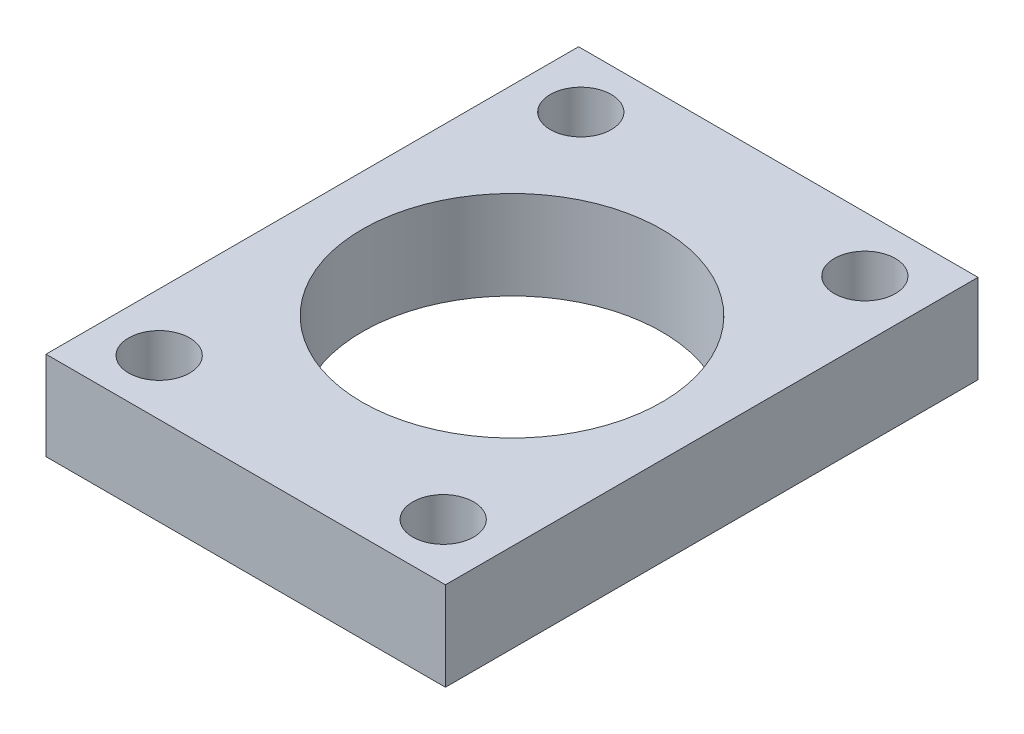
ISO-10303-21;
HEADER;
FILE_DESCRIPTION(('STEP AP214'),'2;1');
FILE_NAME('part.step','',(''),(''),'','','');
FILE_SCHEMA(('AUTOMOTIVE_DESIGN { 1 0 10303 214 1 1 1 1 }'));
ENDSEC;
DATA;
#1=APPLICATION_CONTEXT('core data for automotive mechanical design processes');
#2=APPLICATION_PROTOCOL_DEFINITION('international standard','automotive_design',2000,#1);
#3=PRODUCT_CONTEXT('',#1,'mechanical');
#4=PRODUCT('Part','Part','',(#3));
#5=PRODUCT_RELATED_PRODUCT_CATEGORY('part','',(#4));
#6=PRODUCT_DEFINITION_FORMATION('','',#4);
#7=PRODUCT_DEFINITION_CONTEXT('part definition',#1,'design');
#8=PRODUCT_DEFINITION('design','',#6,#7);
#9=PRODUCT_DEFINITION_SHAPE('','',#8);
#10=(LENGTH_UNIT() NAMED_UNIT(*) SI_UNIT(.MILLI.,.METRE.));
#11=(NAMED_UNIT(*) PLANE_ANGLE_UNIT() SI_UNIT($,.RADIAN.));
#12=(NAMED_UNIT(*) SI_UNIT($,.STERADIAN.) SOLID_ANGLE_UNIT());
#13=UNCERTAINTY_MEASURE_WITH_UNIT(LENGTH_MEASURE(1.E-05),#10,'distance_accuracy_value','');
#14=(GEOMETRIC_REPRESENTATION_CONTEXT(3) GLOBAL_UNCERTAINTY_ASSIGNED_CONTEXT((#13)) GLOBAL_UNIT_ASSIGNED_CONTEXT((#10,
#11,#12)) REPRESENTATION_CONTEXT('',''));
#15=CARTESIAN_POINT('',(0.,0.,0.));
#16=DIRECTION('',(0.,0.,1.));
#17=DIRECTION('',(1.,0.,0.));
#18=AXIS2_PLACEMENT_3D('',#15,#16,#17);
#19=CARTESIAN_POINT('',(-28.575,12.7,-38.1));
#20=DIRECTION('',(1.,0.,0.));
#21=DIRECTION('',(0.,0.,-1.));
#22=AXIS2_PLACEMENT_3D('',#19,#20,#21);
#23=PLANE('',#22);
#24=DIRECTION('',(0.,0.,1.));
#25=VECTOR('',#24,1.);
#26=CARTESIAN_POINT('',(-28.575,0.,-38.1));
#27=LINE('',#26,#25);
#28=CARTESIAN_POINT('',(-28.575,0.,-38.1));
#29=VERTEX_POINT('',#28);
#30=CARTESIAN_POINT('',(-28.575,0.,38.1));
#31=VERTEX_POINT('',#30);
#32=EDGE_CURVE('E75',#29,#31,#27,.T.);
#33=ORIENTED_EDGE('',*,*,#32,.T.);
#34=DIRECTION('',(0.,-1.,0.));
#35=VECTOR('',#34,1.);
#36=CARTESIAN_POINT('',(-28.575,12.7,38.1));
#37=LINE('',#36,#35);
#38=CARTESIAN_POINT('',(-28.575,12.7,38.1));
#39=VERTEX_POINT('',#38);
#40=EDGE_CURVE('E11',#39,#31,#37,.T.);
#41=ORIENTED_EDGE('',*,*,#40,.F.);
#42=DIRECTION('',(0.,0.,1.));
#43=VECTOR('',#42,1.);
#44=CARTESIAN_POINT('',(-28.575,12.7,-38.1));
#45=LINE('',#44,#43);
#46=CARTESIAN_POINT('',(-28.575,12.7,-38.1));
#47=VERTEX_POINT('',#46);
#48=EDGE_CURVE('E98',#47,#39,#45,.T.);
#49=ORIENTED_EDGE('',*,*,#48,.F.);
#50=DIRECTION('',(0.,-1.,0.));
#51=VECTOR('',#50,1.);
#52=CARTESIAN_POINT('',(-28.575,12.7,-38.1));
#53=LINE('',#52,#51);
#54=EDGE_CURVE('E87',#47,#29,#53,.T.);
#55=ORIENTED_EDGE('',*,*,#54,.T.);
#56=EDGE_LOOP('',(#33,#41,#49,#55));
#57=FACE_BOUND('',#56,.T.);
#58=ADVANCED_FACE('F31',(#57),#23,.F.);
#59=CARTESIAN_POINT('',(-28.575,12.7,38.1));
#60=DIRECTION('',(0.,0.,-1.));
#61=DIRECTION('',(-1.,0.,0.));
#62=AXIS2_PLACEMENT_3D('',#59,#60,#61);
#63=PLANE('',#62);
#64=DIRECTION('',(1.,0.,0.));
#65=VECTOR('',#64,1.);
#66=CARTESIAN_POINT('',(-28.575,0.,38.1));
#67=LINE('',#66,#65);
#68=CARTESIAN_POINT('',(28.575,0.,38.1));
#69=VERTEX_POINT('',#68);
#70=EDGE_CURVE('E71',#31,#69,#67,.T.);
#71=ORIENTED_EDGE('',*,*,#70,.T.);
#72=DIRECTION('',(0.,-1.,0.));
#73=VECTOR('',#72,1.);
#74=CARTESIAN_POINT('',(28.575,12.7,38.1));
#75=LINE('',#74,#73);
#76=CARTESIAN_POINT('',(28.575,12.7,38.1));
#77=VERTEX_POINT('',#76);
#78=EDGE_CURVE('E38',#77,#69,#75,.T.);
#79=ORIENTED_EDGE('',*,*,#78,.F.);
#80=DIRECTION('',(1.,0.,0.));
#81=VECTOR('',#80,1.);
#82=CARTESIAN_POINT('',(-28.575,12.7,38.1));
#83=LINE('',#82,#81);
#84=EDGE_CURVE('E83',#39,#77,#83,.T.);
#85=ORIENTED_EDGE('',*,*,#84,.F.);
#86=ORIENTED_EDGE('',*,*,#40,.T.);
#87=EDGE_LOOP('',(#71,#79,#85,#86));
#88=FACE_BOUND('',#87,.T.);
#89=ADVANCED_FACE('F82',(#88),#63,.F.);
#90=CARTESIAN_POINT('',(28.575,12.7,-38.1));
#91=DIRECTION('',(-1.,0.,0.));
#92=DIRECTION('',(0.,0.,1.));
#93=AXIS2_PLACEMENT_3D('',#90,#91,#92);
#94=PLANE('',#93);
#95=DIRECTION('',(0.,0.,-1.));
#96=VECTOR('',#95,1.);
#97=CARTESIAN_POINT('',(28.575,0.,-38.1));
#98=LINE('',#97,#96);
#99=CARTESIAN_POINT('',(28.575,0.,-38.1));
#100=VERTEX_POINT('',#99);
#101=EDGE_CURVE('E76',#69,#100,#98,.T.);
#102=ORIENTED_EDGE('',*,*,#101,.T.);
#103=DIRECTION('',(0.,-1.,0.));
#104=VECTOR('',#103,1.);
#105=CARTESIAN_POINT('',(28.575,12.7,-38.1));
#106=LINE('',#105,#104);
#107=CARTESIAN_POINT('',(28.575,12.7,-38.1));
#108=VERTEX_POINT('',#107);
#109=EDGE_CURVE('E104',#108,#100,#106,.T.);
#110=ORIENTED_EDGE('',*,*,#109,.F.);
#111=DIRECTION('',(0.,0.,-1.));
#112=VECTOR('',#111,1.);
#113=CARTESIAN_POINT('',(28.575,12.7,-38.1));
#114=LINE('',#113,#112);
#115=EDGE_CURVE('E50',#77,#108,#114,.T.);
#116=ORIENTED_EDGE('',*,*,#115,.F.);
#117=ORIENTED_EDGE('',*,*,#78,.T.);
#118=EDGE_LOOP('',(#102,#110,#116,#117));
#119=FACE_BOUND('',#118,.T.);
#120=ADVANCED_FACE('F107',(#119),#94,.F.);
#121=CARTESIAN_POINT('',(-28.575,12.7,-38.1));
#122=DIRECTION('',(0.,0.,1.));
#123=DIRECTION('',(1.,0.,0.));
#124=AXIS2_PLACEMENT_3D('',#121,#122,#123);
#125=PLANE('',#124);
#126=DIRECTION('',(-1.,0.,0.));
#127=VECTOR('',#126,1.);
#128=CARTESIAN_POINT('',(-28.575,0.,-38.1));
#129=LINE('',#128,#127);
#130=EDGE_CURVE('E96',#100,#29,#129,.T.);
#131=ORIENTED_EDGE('',*,*,#130,.T.);
#132=ORIENTED_EDGE('',*,*,#54,.F.);
#133=DIRECTION('',(-1.,0.,0.));
#134=VECTOR('',#133,1.);
#135=CARTESIAN_POINT('',(-28.575,12.7,-38.1));
#136=LINE('',#135,#134);
#137=EDGE_CURVE('E45',#108,#47,#136,.T.);
#138=ORIENTED_EDGE('',*,*,#137,.F.);
#139=ORIENTED_EDGE('',*,*,#109,.T.);
#140=EDGE_LOOP('',(#131,#132,#138,#139));
#141=FACE_BOUND('',#140,.T.);
#142=ADVANCED_FACE('F109',(#141),#125,.F.);
#143=CARTESIAN_POINT('',(-28.575,12.7,-38.1));
#144=DIRECTION('',(0.,1.,0.));
#145=DIRECTION('',(0.,0.,1.));
#146=AXIS2_PLACEMENT_3D('',#143,#144,#145);
#147=PLANE('',#146);
#148=CARTESIAN_POINT('',(-20.32,12.7,-30.1625));
#149=DIRECTION('',(0.,1.,0.));
#150=DIRECTION('',(0.,0.,1.));
#151=AXIS2_PLACEMENT_3D('',#148,#149,#150);
#152=CIRCLE('',#151,4.36498999999999);
#153=CARTESIAN_POINT('',(-20.32,12.7,-25.79751));
#154=VERTEX_POINT('',#153);
#155=EDGE_CURVE('E206',#154,#154,#152,.T.);
#156=ORIENTED_EDGE('',*,*,#155,.F.);
#157=EDGE_LOOP('',(#156));
#158=FACE_BOUND('',#157,.T.);
#159=CARTESIAN_POINT('',(20.32,12.7,-30.1625));
#160=DIRECTION('',(0.,1.,0.));
#161=DIRECTION('',(0.,0.,1.));
#162=AXIS2_PLACEMENT_3D('',#159,#160,#161);
#163=CIRCLE('',#162,4.36498999999999);
#164=CARTESIAN_POINT('',(20.32,12.7,-25.79751));
#165=VERTEX_POINT('',#164);
#166=EDGE_CURVE('E208',#165,#165,#163,.T.);
#167=ORIENTED_EDGE('',*,*,#166,.F.);
#168=EDGE_LOOP('',(#167));
#169=FACE_BOUND('',#168,.T.);
#170=CARTESIAN_POINT('',(20.32,12.7,30.1625));
#171=DIRECTION('',(0.,1.,0.));
#172=DIRECTION('',(0.,0.,1.));
#173=AXIS2_PLACEMENT_3D('',#170,#171,#172);
#174=CIRCLE('',#173,4.36498999999999);
#175=CARTESIAN_POINT('',(20.32,12.7,34.52749));
#176=VERTEX_POINT('',#175);
#177=EDGE_CURVE('E216',#176,#176,#174,.T.);
#178=ORIENTED_EDGE('',*,*,#177,.F.);
#179=EDGE_LOOP('',(#178));
#180=FACE_BOUND('',#179,.T.);
#181=CARTESIAN_POINT('',(-20.32,12.7,30.1625));
#182=DIRECTION('',(0.,1.,0.));
#183=DIRECTION('',(0.,0.,1.));
#184=AXIS2_PLACEMENT_3D('',#181,#182,#183);
#185=CIRCLE('',#184,4.36498999999999);
#186=CARTESIAN_POINT('',(-20.32,12.7,34.52749));
#187=VERTEX_POINT('',#186);
#188=EDGE_CURVE('E222',#187,#187,#185,.T.);
#189=ORIENTED_EDGE('',*,*,#188,.F.);
#190=EDGE_LOOP('',(#189));
#191=FACE_BOUND('',#190,.T.);
#192=CARTESIAN_POINT('',(0.,12.7,0.));
#193=DIRECTION('',(0.,1.,0.));
#194=DIRECTION('',(0.,0.,1.));
#195=AXIS2_PLACEMENT_3D('',#192,#193,#194);
#196=CIRCLE('',#195,21.43125);
#197=CARTESIAN_POINT('',(0.,12.7,21.43125));
#198=VERTEX_POINT('',#197);
#199=EDGE_CURVE('E91',#198,#198,#196,.T.);
#200=ORIENTED_EDGE('',*,*,#199,.F.);
#201=EDGE_LOOP('',(#200));
#202=FACE_BOUND('',#201,.T.);
#203=ORIENTED_EDGE('',*,*,#48,.T.);
#204=ORIENTED_EDGE('',*,*,#84,.T.);
#205=ORIENTED_EDGE('',*,*,#115,.T.);
#206=ORIENTED_EDGE('',*,*,#137,.T.);
#207=EDGE_LOOP('',(#203,#204,#205,#206));
#208=FACE_BOUND('',#207,.T.);
#209=ADVANCED_FACE('F110',(#158,#169,#180,#191,#202,#208),#147,.T.);
#210=CARTESIAN_POINT('',(-28.575,0.,-38.1));
#211=DIRECTION('',(0.,1.,0.));
#212=DIRECTION('',(0.,0.,1.));
#213=AXIS2_PLACEMENT_3D('',#210,#211,#212);
#214=PLANE('',#213);
#215=CARTESIAN_POINT('',(-20.32,0.,-30.1625));
#216=DIRECTION('',(0.,1.,0.));
#217=DIRECTION('',(0.,0.,1.));
#218=AXIS2_PLACEMENT_3D('',#215,#216,#217);
#219=CIRCLE('',#218,4.36499);
#220=CARTESIAN_POINT('',(-20.32,0.,-25.79751));
#221=VERTEX_POINT('',#220);
#222=EDGE_CURVE('E204',#221,#221,#219,.T.);
#223=ORIENTED_EDGE('',*,*,#222,.T.);
#224=EDGE_LOOP('',(#223));
#225=FACE_BOUND('',#224,.T.);
#226=CARTESIAN_POINT('',(20.32,0.,-30.1625));
#227=DIRECTION('',(0.,1.,0.));
#228=DIRECTION('',(0.,0.,1.));
#229=AXIS2_PLACEMENT_3D('',#226,#227,#228);
#230=CIRCLE('',#229,4.36499);
#231=CARTESIAN_POINT('',(20.32,0.,-25.79751));
#232=VERTEX_POINT('',#231);
#233=EDGE_CURVE('E213',#232,#232,#230,.T.);
#234=ORIENTED_EDGE('',*,*,#233,.T.);
#235=EDGE_LOOP('',(#234));
#236=FACE_BOUND('',#235,.T.);
#237=CARTESIAN_POINT('',(20.32,0.,30.1625));
#238=DIRECTION('',(0.,1.,0.));
#239=DIRECTION('',(0.,0.,1.));
#240=AXIS2_PLACEMENT_3D('',#237,#238,#239);
#241=CIRCLE('',#240,4.36499);
#242=CARTESIAN_POINT('',(20.32,0.,34.52749));
#243=VERTEX_POINT('',#242);
#244=EDGE_CURVE('E219',#243,#243,#241,.T.);
#245=ORIENTED_EDGE('',*,*,#244,.T.);
#246=EDGE_LOOP('',(#245));
#247=FACE_BOUND('',#246,.T.);
#248=CARTESIAN_POINT('',(-20.32,0.,30.1625));
#249=DIRECTION('',(0.,1.,0.));
#250=DIRECTION('',(0.,0.,1.));
#251=AXIS2_PLACEMENT_3D('',#248,#249,#250);
#252=CIRCLE('',#251,4.36499);
#253=CARTESIAN_POINT('',(-20.32,0.,34.52749));
#254=VERTEX_POINT('',#253);
#255=EDGE_CURVE('E225',#254,#254,#252,.T.);
#256=ORIENTED_EDGE('',*,*,#255,.T.);
#257=EDGE_LOOP('',(#256));
#258=FACE_BOUND('',#257,.T.);
#259=CARTESIAN_POINT('',(0.,0.,0.));
#260=DIRECTION('',(0.,1.,0.));
#261=DIRECTION('',(0.,0.,1.));
#262=AXIS2_PLACEMENT_3D('',#259,#260,#261);
#263=CIRCLE('',#262,21.43125);
#264=CARTESIAN_POINT('',(0.,0.,21.43125));
#265=VERTEX_POINT('',#264);
#266=EDGE_CURVE('E88',#265,#265,#263,.T.);
#267=ORIENTED_EDGE('',*,*,#266,.T.);
#268=EDGE_LOOP('',(#267));
#269=FACE_BOUND('',#268,.T.);
#270=ORIENTED_EDGE('',*,*,#32,.F.);
#271=ORIENTED_EDGE('',*,*,#130,.F.);
#272=ORIENTED_EDGE('',*,*,#101,.F.);
#273=ORIENTED_EDGE('',*,*,#70,.F.);
#274=EDGE_LOOP('',(#270,#271,#272,#273));
#275=FACE_BOUND('',#274,.T.);
#276=ADVANCED_FACE('F72',(#225,#236,#247,#258,#269,#275),#214,.F.);
#277=CARTESIAN_POINT('',(0.,0.,0.));
#278=DIRECTION('',(0.,1.,0.));
#279=DIRECTION('',(0.,0.,1.));
#280=AXIS2_PLACEMENT_3D('',#277,#278,#279);
#281=CYLINDRICAL_SURFACE('',#280,21.43125);
#282=ORIENTED_EDGE('',*,*,#266,.F.);
#283=EDGE_LOOP('',(#282));
#284=FACE_BOUND('',#283,.T.);
#285=ORIENTED_EDGE('',*,*,#199,.T.);
#286=EDGE_LOOP('',(#285));
#287=FACE_BOUND('',#286,.T.);
#288=ADVANCED_FACE('F118',(#284,#287),#281,.F.);
#289=CARTESIAN_POINT('',(-20.32,12.7,30.1625));
#290=DIRECTION('',(0.,1.,0.));
#291=DIRECTION('',(0.,0.,1.));
#292=AXIS2_PLACEMENT_3D('',#289,#290,#291);
#293=CYLINDRICAL_SURFACE('',#292,4.36498999999999);
#294=ORIENTED_EDGE('',*,*,#255,.F.);
#295=EDGE_LOOP('',(#294));
#296=FACE_BOUND('',#295,.T.);
#297=ORIENTED_EDGE('',*,*,#188,.T.);
#298=EDGE_LOOP('',(#297));
#299=FACE_BOUND('',#298,.T.);
#300=ADVANCED_FACE('F147',(#296,#299),#293,.F.);
#301=CARTESIAN_POINT('',(20.32,12.7,30.1625));
#302=DIRECTION('',(0.,1.,0.));
#303=DIRECTION('',(0.,0.,1.));
#304=AXIS2_PLACEMENT_3D('',#301,#302,#303);
#305=CYLINDRICAL_SURFACE('',#304,4.36498999999999);
#306=ORIENTED_EDGE('',*,*,#244,.F.);
#307=EDGE_LOOP('',(#306));
#308=FACE_BOUND('',#307,.T.);
#309=ORIENTED_EDGE('',*,*,#177,.T.);
#310=EDGE_LOOP('',(#309));
#311=FACE_BOUND('',#310,.T.);
#312=ADVANCED_FACE('F167',(#308,#311),#305,.F.);
#313=CARTESIAN_POINT('',(20.32,12.7,-30.1625));
#314=DIRECTION('',(0.,1.,0.));
#315=DIRECTION('',(0.,0.,1.));
#316=AXIS2_PLACEMENT_3D('',#313,#314,#315);
#317=CYLINDRICAL_SURFACE('',#316,4.36498999999999);
#318=ORIENTED_EDGE('',*,*,#233,.F.);
#319=EDGE_LOOP('',(#318));
#320=FACE_BOUND('',#319,.T.);
#321=ORIENTED_EDGE('',*,*,#166,.T.);
#322=EDGE_LOOP('',(#321));
#323=FACE_BOUND('',#322,.T.);
#324=ADVANCED_FACE('F177',(#320,#323),#317,.F.);
#325=CARTESIAN_POINT('',(-20.32,12.7,-30.1625));
#326=DIRECTION('',(0.,1.,0.));
#327=DIRECTION('',(0.,0.,1.));
#328=AXIS2_PLACEMENT_3D('',#325,#326,#327);
#329=CYLINDRICAL_SURFACE('',#328,4.36498999999999);
#330=ORIENTED_EDGE('',*,*,#222,.F.);
#331=EDGE_LOOP('',(#330));
#332=FACE_BOUND('',#331,.T.);
#333=ORIENTED_EDGE('',*,*,#155,.T.);
#334=EDGE_LOOP('',(#333));
#335=FACE_BOUND('',#334,.T.);
#336=ADVANCED_FACE('F187',(#332,#335),#329,.F.);
#337=CLOSED_SHELL('',(#58,#89,#120,#142,#209,#276,#288,#300,#312,#324,#336));
#338=MANIFOLD_SOLID_BREP('B2',#337);
#339=ADVANCED_BREP_SHAPE_REPRESENTATION('',(#18,#338),#14);
#340=SHAPE_DEFINITION_REPRESENTATION(#9,#339);
ENDSEC;
END-ISO-10303-21;
